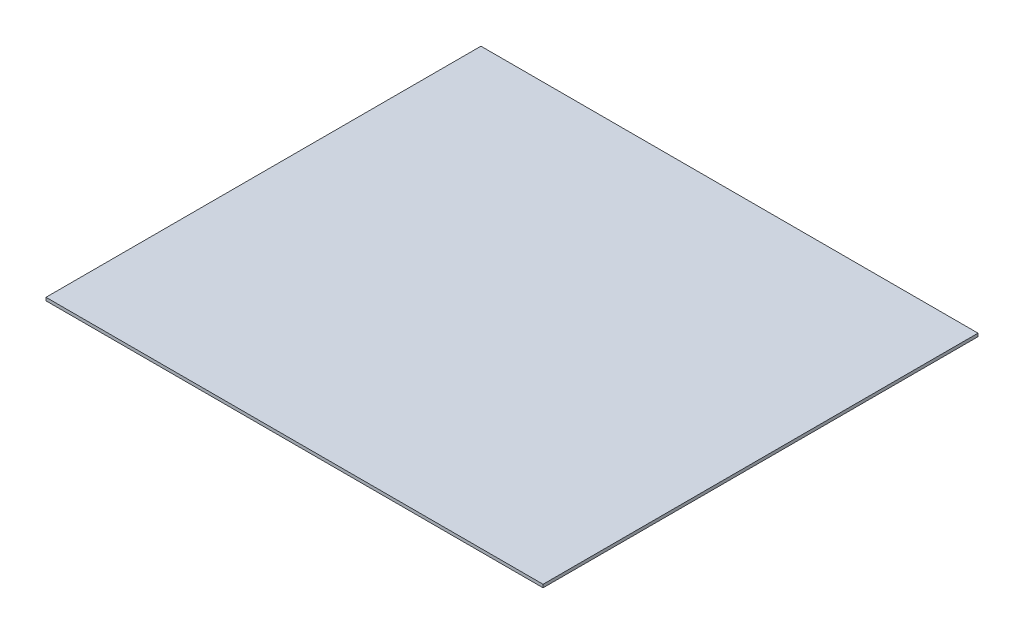
ISO-10303-21;
HEADER;
FILE_DESCRIPTION(('STEP AP214'),'2;1');
FILE_NAME('part.step','',(''),(''),'','','');
FILE_SCHEMA(('AUTOMOTIVE_DESIGN { 1 0 10303 214 1 1 1 1 }'));
ENDSEC;
DATA;
#1=APPLICATION_CONTEXT('core data for automotive mechanical design processes');
#2=APPLICATION_PROTOCOL_DEFINITION('international standard','automotive_design',2000,#1);
#3=PRODUCT_CONTEXT('',#1,'mechanical');
#4=PRODUCT('Part','Part','',(#3));
#5=PRODUCT_RELATED_PRODUCT_CATEGORY('part','',(#4));
#6=PRODUCT_DEFINITION_FORMATION('','',#4);
#7=PRODUCT_DEFINITION_CONTEXT('part definition',#1,'design');
#8=PRODUCT_DEFINITION('design','',#6,#7);
#9=PRODUCT_DEFINITION_SHAPE('','',#8);
#10=(LENGTH_UNIT() NAMED_UNIT(*) SI_UNIT(.MILLI.,.METRE.));
#11=(NAMED_UNIT(*) PLANE_ANGLE_UNIT() SI_UNIT($,.RADIAN.));
#12=(NAMED_UNIT(*) SI_UNIT($,.STERADIAN.) SOLID_ANGLE_UNIT());
#13=UNCERTAINTY_MEASURE_WITH_UNIT(LENGTH_MEASURE(1.E-05),#10,'distance_accuracy_value','');
#14=(GEOMETRIC_REPRESENTATION_CONTEXT(3) GLOBAL_UNCERTAINTY_ASSIGNED_CONTEXT((#13)) GLOBAL_UNIT_ASSIGNED_CONTEXT((#10,
#11,#12)) REPRESENTATION_CONTEXT('',''));
#15=CARTESIAN_POINT('',(0.,0.,0.));
#16=DIRECTION('',(0.,0.,1.));
#17=DIRECTION('',(1.,0.,0.));
#18=AXIS2_PLACEMENT_3D('',#15,#16,#17);
#19=CARTESIAN_POINT('',(0.,5.,-700.));
#20=DIRECTION('',(-1.,0.,0.));
#21=DIRECTION('',(0.,0.,1.));
#22=AXIS2_PLACEMENT_3D('',#19,#20,#21);
#23=PLANE('',#22);
#24=DIRECTION('',(0.,0.,-1.));
#25=VECTOR('',#24,1.);
#26=CARTESIAN_POINT('',(0.,0.,-700.));
#27=LINE('',#26,#25);
#28=CARTESIAN_POINT('',(0.,0.,0.));
#29=VERTEX_POINT('',#28);
#30=CARTESIAN_POINT('',(0.,0.,-700.));
#31=VERTEX_POINT('',#30);
#32=EDGE_CURVE('E98',#29,#31,#27,.T.);
#33=ORIENTED_EDGE('',*,*,#32,.T.);
#34=DIRECTION('',(0.,-1.,0.));
#35=VECTOR('',#34,1.);
#36=CARTESIAN_POINT('',(0.,5.,-700.));
#37=LINE('',#36,#35);
#38=CARTESIAN_POINT('',(0.,5.,-700.));
#39=VERTEX_POINT('',#38);
#40=EDGE_CURVE('E11',#39,#31,#37,.T.);
#41=ORIENTED_EDGE('',*,*,#40,.F.);
#42=DIRECTION('',(0.,0.,-1.));
#43=VECTOR('',#42,1.);
#44=CARTESIAN_POINT('',(0.,5.,-700.));
#45=LINE('',#44,#43);
#46=CARTESIAN_POINT('',(0.,5.,0.));
#47=VERTEX_POINT('',#46);
#48=EDGE_CURVE('E86',#47,#39,#45,.T.);
#49=ORIENTED_EDGE('',*,*,#48,.F.);
#50=DIRECTION('',(0.,-1.,0.));
#51=VECTOR('',#50,1.);
#52=CARTESIAN_POINT('',(0.,5.,0.));
#53=LINE('',#52,#51);
#54=EDGE_CURVE('E94',#47,#29,#53,.T.);
#55=ORIENTED_EDGE('',*,*,#54,.T.);
#56=EDGE_LOOP('',(#33,#41,#49,#55));
#57=FACE_BOUND('',#56,.T.);
#58=ADVANCED_FACE('F35',(#57),#23,.F.);
#59=CARTESIAN_POINT('',(-800.,5.,-700.));
#60=DIRECTION('',(0.,0.,1.));
#61=DIRECTION('',(1.,0.,0.));
#62=AXIS2_PLACEMENT_3D('',#59,#60,#61);
#63=PLANE('',#62);
#64=DIRECTION('',(-1.,0.,0.));
#65=VECTOR('',#64,1.);
#66=CARTESIAN_POINT('',(-800.,0.,-700.));
#67=LINE('',#66,#65);
#68=CARTESIAN_POINT('',(-800.,0.,-700.));
#69=VERTEX_POINT('',#68);
#70=EDGE_CURVE('E90',#31,#69,#67,.T.);
#71=ORIENTED_EDGE('',*,*,#70,.T.);
#72=DIRECTION('',(0.,-1.,0.));
#73=VECTOR('',#72,1.);
#74=CARTESIAN_POINT('',(-800.,5.,-700.));
#75=LINE('',#74,#73);
#76=CARTESIAN_POINT('',(-800.,5.,-700.));
#77=VERTEX_POINT('',#76);
#78=EDGE_CURVE('E43',#77,#69,#75,.T.);
#79=ORIENTED_EDGE('',*,*,#78,.F.);
#80=DIRECTION('',(-1.,0.,0.));
#81=VECTOR('',#80,1.);
#82=CARTESIAN_POINT('',(-800.,5.,-700.));
#83=LINE('',#82,#81);
#84=EDGE_CURVE('E81',#39,#77,#83,.T.);
#85=ORIENTED_EDGE('',*,*,#84,.F.);
#86=ORIENTED_EDGE('',*,*,#40,.T.);
#87=EDGE_LOOP('',(#71,#79,#85,#86));
#88=FACE_BOUND('',#87,.T.);
#89=ADVANCED_FACE('F89',(#88),#63,.F.);
#90=CARTESIAN_POINT('',(-800.,5.,0.));
#91=DIRECTION('',(1.,0.,0.));
#92=DIRECTION('',(0.,0.,-1.));
#93=AXIS2_PLACEMENT_3D('',#90,#91,#92);
#94=PLANE('',#93);
#95=DIRECTION('',(0.,0.,1.));
#96=VECTOR('',#95,1.);
#97=CARTESIAN_POINT('',(-800.,0.,0.));
#98=LINE('',#97,#96);
#99=CARTESIAN_POINT('',(-800.,0.,0.));
#100=VERTEX_POINT('',#99);
#101=EDGE_CURVE('E68',#69,#100,#98,.T.);
#102=ORIENTED_EDGE('',*,*,#101,.T.);
#103=DIRECTION('',(0.,-1.,0.));
#104=VECTOR('',#103,1.);
#105=CARTESIAN_POINT('',(-800.,5.,0.));
#106=LINE('',#105,#104);
#107=CARTESIAN_POINT('',(-800.,5.,0.));
#108=VERTEX_POINT('',#107);
#109=EDGE_CURVE('E91',#108,#100,#106,.T.);
#110=ORIENTED_EDGE('',*,*,#109,.F.);
#111=DIRECTION('',(0.,0.,1.));
#112=VECTOR('',#111,1.);
#113=CARTESIAN_POINT('',(-800.,5.,0.));
#114=LINE('',#113,#112);
#115=EDGE_CURVE('E84',#77,#108,#114,.T.);
#116=ORIENTED_EDGE('',*,*,#115,.F.);
#117=ORIENTED_EDGE('',*,*,#78,.T.);
#118=EDGE_LOOP('',(#102,#110,#116,#117));
#119=FACE_BOUND('',#118,.T.);
#120=ADVANCED_FACE('F92',(#119),#94,.F.);
#121=CARTESIAN_POINT('',(0.,5.,0.));
#122=DIRECTION('',(0.,0.,-1.));
#123=DIRECTION('',(-1.,0.,0.));
#124=AXIS2_PLACEMENT_3D('',#121,#122,#123);
#125=PLANE('',#124);
#126=DIRECTION('',(1.,0.,0.));
#127=VECTOR('',#126,1.);
#128=CARTESIAN_POINT('',(0.,0.,0.));
#129=LINE('',#128,#127);
#130=EDGE_CURVE('E74',#100,#29,#129,.T.);
#131=ORIENTED_EDGE('',*,*,#130,.T.);
#132=ORIENTED_EDGE('',*,*,#54,.F.);
#133=DIRECTION('',(1.,0.,0.));
#134=VECTOR('',#133,1.);
#135=CARTESIAN_POINT('',(0.,5.,0.));
#136=LINE('',#135,#134);
#137=EDGE_CURVE('E51',#108,#47,#136,.T.);
#138=ORIENTED_EDGE('',*,*,#137,.F.);
#139=ORIENTED_EDGE('',*,*,#109,.T.);
#140=EDGE_LOOP('',(#131,#132,#138,#139));
#141=FACE_BOUND('',#140,.T.);
#142=ADVANCED_FACE('F105',(#141),#125,.F.);
#143=CARTESIAN_POINT('',(0.,5.,0.));
#144=DIRECTION('',(0.,-1.,0.));
#145=DIRECTION('',(0.,0.,-1.));
#146=AXIS2_PLACEMENT_3D('',#143,#144,#145);
#147=PLANE('',#146);
#148=ORIENTED_EDGE('',*,*,#48,.T.);
#149=ORIENTED_EDGE('',*,*,#84,.T.);
#150=ORIENTED_EDGE('',*,*,#115,.T.);
#151=ORIENTED_EDGE('',*,*,#137,.T.);
#152=EDGE_LOOP('',(#148,#149,#150,#151));
#153=FACE_BOUND('',#152,.T.);
#154=ADVANCED_FACE('F82',(#153),#147,.F.);
#155=CARTESIAN_POINT('',(0.,0.,0.));
#156=DIRECTION('',(0.,-1.,0.));
#157=DIRECTION('',(0.,0.,-1.));
#158=AXIS2_PLACEMENT_3D('',#155,#156,#157);
#159=PLANE('',#158);
#160=ORIENTED_EDGE('',*,*,#32,.F.);
#161=ORIENTED_EDGE('',*,*,#130,.F.);
#162=ORIENTED_EDGE('',*,*,#101,.F.);
#163=ORIENTED_EDGE('',*,*,#70,.F.);
#164=EDGE_LOOP('',(#160,#161,#162,#163));
#165=FACE_BOUND('',#164,.T.);
#166=ADVANCED_FACE('F108',(#165),#159,.T.);
#167=CLOSED_SHELL('',(#58,#89,#120,#142,#154,#166));
#168=MANIFOLD_SOLID_BREP('B2',#167);
#169=ADVANCED_BREP_SHAPE_REPRESENTATION('',(#18,#168),#14);
#170=SHAPE_DEFINITION_REPRESENTATION(#9,#169);
ENDSEC;
END-ISO-10303-21;
